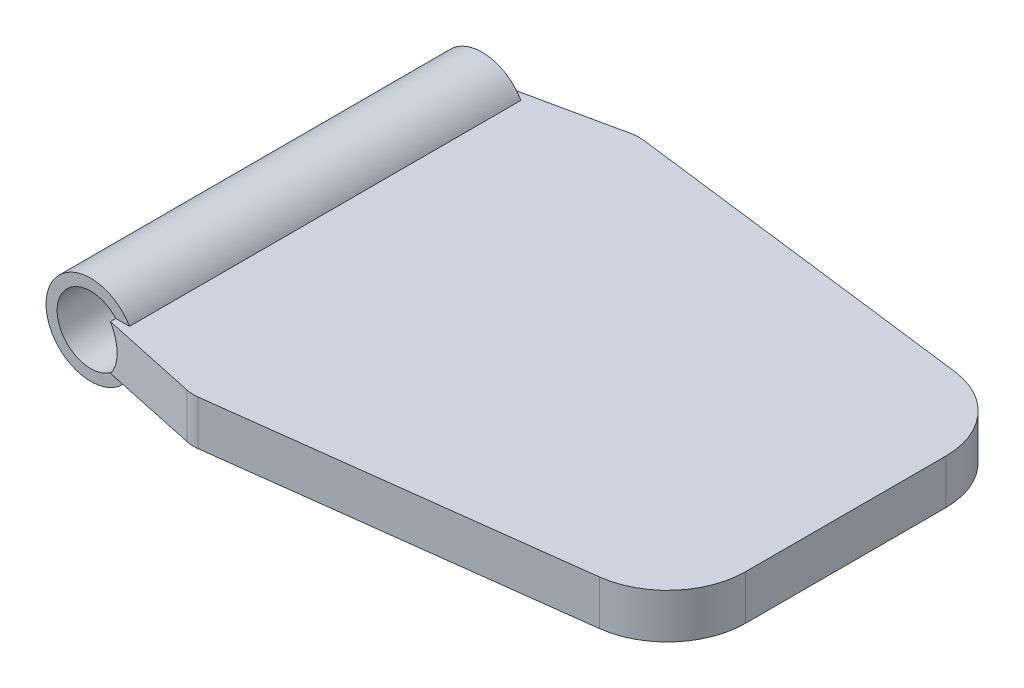
ISO-10303-21;
HEADER;
FILE_DESCRIPTION(('STEP AP214'),'2;1');
FILE_NAME('part.step','',(''),(''),'','','');
FILE_SCHEMA(('AUTOMOTIVE_DESIGN { 1 0 10303 214 1 1 1 1 }'));
ENDSEC;
DATA;
#1=APPLICATION_CONTEXT('core data for automotive mechanical design processes');
#2=APPLICATION_PROTOCOL_DEFINITION('international standard','automotive_design',2000,#1);
#3=PRODUCT_CONTEXT('',#1,'mechanical');
#4=PRODUCT('Part','Part','',(#3));
#5=PRODUCT_RELATED_PRODUCT_CATEGORY('part','',(#4));
#6=PRODUCT_DEFINITION_FORMATION('','',#4);
#7=PRODUCT_DEFINITION_CONTEXT('part definition',#1,'design');
#8=PRODUCT_DEFINITION('design','',#6,#7);
#9=PRODUCT_DEFINITION_SHAPE('','',#8);
#10=(LENGTH_UNIT() NAMED_UNIT(*) SI_UNIT(.MILLI.,.METRE.));
#11=(NAMED_UNIT(*) PLANE_ANGLE_UNIT() SI_UNIT($,.RADIAN.));
#12=(NAMED_UNIT(*) SI_UNIT($,.STERADIAN.) SOLID_ANGLE_UNIT());
#13=UNCERTAINTY_MEASURE_WITH_UNIT(LENGTH_MEASURE(1.E-05),#10,'distance_accuracy_value','');
#14=(GEOMETRIC_REPRESENTATION_CONTEXT(3) GLOBAL_UNCERTAINTY_ASSIGNED_CONTEXT((#13)) GLOBAL_UNIT_ASSIGNED_CONTEXT((#10,
#11,#12)) REPRESENTATION_CONTEXT('',''));
#15=CARTESIAN_POINT('',(0.,0.,0.));
#16=DIRECTION('',(0.,0.,1.));
#17=DIRECTION('',(1.,0.,0.));
#18=AXIS2_PLACEMENT_3D('',#15,#16,#17);
#19=CARTESIAN_POINT('',(0.,10.16,88.9));
#20=DIRECTION('',(0.210109323710123,0.,-0.977677897924503));
#21=DIRECTION('',(-0.977677897924503,0.,-0.210109323710123));
#22=AXIS2_PLACEMENT_3D('',#19,#20,#21);
#23=PLANE('',#22);
#24=DIRECTION('',(0.977677897924503,0.,0.210109323710123));
#25=VECTOR('',#24,1.);
#26=CARTESIAN_POINT('',(0.,10.16,88.9));
#27=LINE('',#26,#25);
#28=CARTESIAN_POINT('',(5.67961266284946,10.16,90.1205856121531));
#29=VERTEX_POINT('',#28);
#30=CARTESIAN_POINT('',(27.899788868323,10.16,94.8958456493932));
#31=VERTEX_POINT('',#30);
#32=EDGE_CURVE('E162',#29,#31,#27,.T.);
#33=ORIENTED_EDGE('',*,*,#32,.F.);
#34=CARTESIAN_POINT('',(0.,5.08,88.9));
#35=DIRECTION('',(0.210109323710123,0.,-0.977677897924503));
#36=DIRECTION('',(0.977677897924503,0.,0.210109323710123));
#37=AXIS2_PLACEMENT_3D('',#34,#35,#36);
#38=ELLIPSE('',#37,7.79397797186208,7.62);
#39=CARTESIAN_POINT('',(5.67961266284946,0.,90.1205856121531));
#40=VERTEX_POINT('',#39);
#41=EDGE_CURVE('E239',#29,#40,#38,.T.);
#42=ORIENTED_EDGE('',*,*,#41,.T.);
#43=DIRECTION('',(0.977677897924503,0.,0.210109323710123));
#44=VECTOR('',#43,1.);
#45=CARTESIAN_POINT('',(0.,0.,88.9));
#46=LINE('',#45,#44);
#47=CARTESIAN_POINT('',(27.899788868323,0.,94.8958456493932));
#48=VERTEX_POINT('',#47);
#49=EDGE_CURVE('E161',#40,#48,#46,.T.);
#50=ORIENTED_EDGE('',*,*,#49,.T.);
#51=DIRECTION('',(0.,-1.,0.));
#52=VECTOR('',#51,1.);
#53=CARTESIAN_POINT('',(27.899788868323,10.16,94.8958456493932));
#54=LINE('',#53,#52);
#55=EDGE_CURVE('E218',#31,#48,#54,.T.);
#56=ORIENTED_EDGE('',*,*,#55,.F.);
#57=EDGE_LOOP('',(#33,#42,#50,#56));
#58=FACE_BOUND('',#57,.T.);
#59=ADVANCED_FACE('F33',(#58),#23,.F.);
#60=CARTESIAN_POINT('',(29.5008219149942,10.16,87.4459400672085));
#61=DIRECTION('',(0.,-1.,0.));
#62=DIRECTION('',(0.,0.,-1.));
#63=AXIS2_PLACEMENT_3D('',#60,#61,#62);
#64=CYLINDRICAL_SURFACE('',#63,7.61999999999999);
#65=CARTESIAN_POINT('',(29.5008219149942,0.,87.4459400672085));
#66=DIRECTION('',(0.,1.,0.));
#67=DIRECTION('',(0.,0.,-1.));
#68=AXIS2_PLACEMENT_3D('',#65,#66,#67);
#69=CIRCLE('',#68,7.61999999999999);
#70=CARTESIAN_POINT('',(30.4518805531933,0.,95.0063558935178));
#71=VERTEX_POINT('',#70);
#72=EDGE_CURVE('E182',#48,#71,#69,.T.);
#73=ORIENTED_EDGE('',*,*,#72,.T.);
#74=DIRECTION('',(0.,-1.,0.));
#75=VECTOR('',#74,1.);
#76=CARTESIAN_POINT('',(30.4518805531933,10.16,95.0063558935178));
#77=LINE('',#76,#75);
#78=CARTESIAN_POINT('',(30.4518805531933,10.16,95.0063558935178));
#79=VERTEX_POINT('',#78);
#80=EDGE_CURVE('E215',#79,#71,#77,.T.);
#81=ORIENTED_EDGE('',*,*,#80,.F.);
#82=CARTESIAN_POINT('',(29.5008219149942,10.16,87.4459400672085));
#83=DIRECTION('',(0.,1.,0.));
#84=DIRECTION('',(0.,0.,-1.));
#85=AXIS2_PLACEMENT_3D('',#82,#83,#84);
#86=CIRCLE('',#85,7.61999999999999);
#87=EDGE_CURVE('E164',#31,#79,#86,.T.);
#88=ORIENTED_EDGE('',*,*,#87,.F.);
#89=ORIENTED_EDGE('',*,*,#55,.T.);
#90=EDGE_LOOP('',(#73,#81,#88,#89));
#91=FACE_BOUND('',#90,.T.);
#92=ADVANCED_FACE('F251',(#91),#64,.T.);
#93=CARTESIAN_POINT('',(30.4518805531933,10.16,95.0063558935178));
#94=DIRECTION('',(-0.124810844908009,0.,-0.992180554633757));
#95=DIRECTION('',(-0.992180554633757,0.,0.124810844908009));
#96=AXIS2_PLACEMENT_3D('',#93,#94,#95);
#97=PLANE('',#96);
#98=DIRECTION('',(0.992180554633757,0.,-0.124810844908009));
#99=VECTOR('',#98,1.);
#100=CARTESIAN_POINT('',(30.4518805531933,0.,95.0063558935178));
#101=LINE('',#100,#99);
#102=CARTESIAN_POINT('',(111.439136822464,0.,84.8186054538003));
#103=VERTEX_POINT('',#102);
#104=EDGE_CURVE('E184',#71,#103,#101,.T.);
#105=ORIENTED_EDGE('',*,*,#104,.T.);
#106=DIRECTION('',(0.,-1.,0.));
#107=VECTOR('',#106,1.);
#108=CARTESIAN_POINT('',(111.439136822464,10.16,84.8186054538003));
#109=LINE('',#108,#107);
#110=CARTESIAN_POINT('',(111.439136822464,10.16,84.8186054538003));
#111=VERTEX_POINT('',#110);
#112=EDGE_CURVE('E212',#111,#103,#109,.T.);
#113=ORIENTED_EDGE('',*,*,#112,.F.);
#114=DIRECTION('',(0.992180554633757,0.,-0.124810844908009));
#115=VECTOR('',#114,1.);
#116=CARTESIAN_POINT('',(30.4518805531933,10.16,95.0063558935178));
#117=LINE('',#116,#115);
#118=EDGE_CURVE('E167',#79,#111,#117,.T.);
#119=ORIENTED_EDGE('',*,*,#118,.F.);
#120=ORIENTED_EDGE('',*,*,#80,.T.);
#121=EDGE_LOOP('',(#105,#113,#119,#120));
#122=FACE_BOUND('',#121,.T.);
#123=ADVANCED_FACE('F257',(#122),#97,.F.);
#124=CARTESIAN_POINT('',(109.22,10.16,67.1776351924121));
#125=DIRECTION('',(0.,-1.,0.));
#126=DIRECTION('',(0.,0.,-1.));
#127=AXIS2_PLACEMENT_3D('',#124,#125,#126);
#128=CYLINDRICAL_SURFACE('',#127,17.78);
#129=CARTESIAN_POINT('',(109.22,0.,67.1776351924121));
#130=DIRECTION('',(0.,1.,0.));
#131=DIRECTION('',(0.,0.,1.));
#132=AXIS2_PLACEMENT_3D('',#129,#130,#131);
#133=CIRCLE('',#132,17.78);
#134=CARTESIAN_POINT('',(127.,0.,67.177635192412));
#135=VERTEX_POINT('',#134);
#136=EDGE_CURVE('E186',#103,#135,#133,.T.);
#137=ORIENTED_EDGE('',*,*,#136,.T.);
#138=DIRECTION('',(0.,-1.,0.));
#139=VECTOR('',#138,1.);
#140=CARTESIAN_POINT('',(127.,10.16,67.177635192412));
#141=LINE('',#140,#139);
#142=CARTESIAN_POINT('',(127.,10.16,67.177635192412));
#143=VERTEX_POINT('',#142);
#144=EDGE_CURVE('E209',#143,#135,#141,.T.);
#145=ORIENTED_EDGE('',*,*,#144,.F.);
#146=CARTESIAN_POINT('',(109.22,10.16,67.1776351924121));
#147=DIRECTION('',(0.,1.,0.));
#148=DIRECTION('',(0.,0.,1.));
#149=AXIS2_PLACEMENT_3D('',#146,#147,#148);
#150=CIRCLE('',#149,17.78);
#151=EDGE_CURVE('E169',#111,#143,#150,.T.);
#152=ORIENTED_EDGE('',*,*,#151,.F.);
#153=ORIENTED_EDGE('',*,*,#112,.T.);
#154=EDGE_LOOP('',(#137,#145,#152,#153));
#155=FACE_BOUND('',#154,.T.);
#156=ADVANCED_FACE('F261',(#155),#128,.T.);
#157=CARTESIAN_POINT('',(127.,10.16,21.722364807588));
#158=DIRECTION('',(-1.,0.,0.));
#159=DIRECTION('',(0.,0.,1.));
#160=AXIS2_PLACEMENT_3D('',#157,#158,#159);
#161=PLANE('',#160);
#162=DIRECTION('',(0.,0.,-1.));
#163=VECTOR('',#162,1.);
#164=CARTESIAN_POINT('',(127.,0.,21.722364807588));
#165=LINE('',#164,#163);
#166=CARTESIAN_POINT('',(127.,0.,21.722364807588));
#167=VERTEX_POINT('',#166);
#168=EDGE_CURVE('E188',#135,#167,#165,.T.);
#169=ORIENTED_EDGE('',*,*,#168,.T.);
#170=DIRECTION('',(0.,-1.,0.));
#171=VECTOR('',#170,1.);
#172=CARTESIAN_POINT('',(127.,10.16,21.722364807588));
#173=LINE('',#172,#171);
#174=CARTESIAN_POINT('',(127.,10.16,21.722364807588));
#175=VERTEX_POINT('',#174);
#176=EDGE_CURVE('E206',#175,#167,#173,.T.);
#177=ORIENTED_EDGE('',*,*,#176,.F.);
#178=DIRECTION('',(0.,0.,-1.));
#179=VECTOR('',#178,1.);
#180=CARTESIAN_POINT('',(127.,10.16,21.722364807588));
#181=LINE('',#180,#179);
#182=EDGE_CURVE('E171',#143,#175,#181,.T.);
#183=ORIENTED_EDGE('',*,*,#182,.F.);
#184=ORIENTED_EDGE('',*,*,#144,.T.);
#185=EDGE_LOOP('',(#169,#177,#183,#184));
#186=FACE_BOUND('',#185,.T.);
#187=ADVANCED_FACE('F266',(#186),#161,.F.);
#188=CARTESIAN_POINT('',(109.22,10.16,21.7223648075879));
#189=DIRECTION('',(0.,-1.,0.));
#190=DIRECTION('',(0.,0.,-1.));
#191=AXIS2_PLACEMENT_3D('',#188,#189,#190);
#192=CYLINDRICAL_SURFACE('',#191,17.78);
#193=CARTESIAN_POINT('',(109.22,0.,21.7223648075879));
#194=DIRECTION('',(0.,1.,0.));
#195=DIRECTION('',(0.,0.,1.));
#196=AXIS2_PLACEMENT_3D('',#193,#194,#195);
#197=CIRCLE('',#196,17.78);
#198=CARTESIAN_POINT('',(111.439136822464,0.,4.0813945461997));
#199=VERTEX_POINT('',#198);
#200=EDGE_CURVE('E190',#167,#199,#197,.T.);
#201=ORIENTED_EDGE('',*,*,#200,.T.);
#202=DIRECTION('',(0.,-1.,0.));
#203=VECTOR('',#202,1.);
#204=CARTESIAN_POINT('',(111.439136822464,10.16,4.0813945461997));
#205=LINE('',#204,#203);
#206=CARTESIAN_POINT('',(111.439136822464,10.16,4.0813945461997));
#207=VERTEX_POINT('',#206);
#208=EDGE_CURVE('E203',#207,#199,#205,.T.);
#209=ORIENTED_EDGE('',*,*,#208,.F.);
#210=CARTESIAN_POINT('',(109.22,10.16,21.7223648075879));
#211=DIRECTION('',(0.,1.,0.));
#212=DIRECTION('',(0.,0.,1.));
#213=AXIS2_PLACEMENT_3D('',#210,#211,#212);
#214=CIRCLE('',#213,17.78);
#215=EDGE_CURVE('E173',#175,#207,#214,.T.);
#216=ORIENTED_EDGE('',*,*,#215,.F.);
#217=ORIENTED_EDGE('',*,*,#176,.T.);
#218=EDGE_LOOP('',(#201,#209,#216,#217));
#219=FACE_BOUND('',#218,.T.);
#220=ADVANCED_FACE('F272',(#219),#192,.T.);
#221=CARTESIAN_POINT('',(30.4518805531933,10.16,-6.10635589351778));
#222=DIRECTION('',(-0.124810844908009,0.,0.992180554633757));
#223=DIRECTION('',(0.992180554633757,0.,0.124810844908009));
#224=AXIS2_PLACEMENT_3D('',#221,#222,#223);
#225=PLANE('',#224);
#226=DIRECTION('',(-0.992180554633757,0.,-0.124810844908009));
#227=VECTOR('',#226,1.);
#228=CARTESIAN_POINT('',(30.4518805531933,0.,-6.10635589351778));
#229=LINE('',#228,#227);
#230=CARTESIAN_POINT('',(30.4518805531933,0.,-6.10635589351778));
#231=VERTEX_POINT('',#230);
#232=EDGE_CURVE('E192',#199,#231,#229,.T.);
#233=ORIENTED_EDGE('',*,*,#232,.T.);
#234=DIRECTION('',(0.,-1.,0.));
#235=VECTOR('',#234,1.);
#236=CARTESIAN_POINT('',(30.4518805531933,10.16,-6.10635589351778));
#237=LINE('',#236,#235);
#238=CARTESIAN_POINT('',(30.4518805531933,10.16,-6.10635589351778));
#239=VERTEX_POINT('',#238);
#240=EDGE_CURVE('E200',#239,#231,#237,.T.);
#241=ORIENTED_EDGE('',*,*,#240,.F.);
#242=DIRECTION('',(-0.992180554633757,0.,-0.124810844908009));
#243=VECTOR('',#242,1.);
#244=CARTESIAN_POINT('',(30.4518805531933,10.16,-6.10635589351778));
#245=LINE('',#244,#243);
#246=EDGE_CURVE('E175',#207,#239,#245,.T.);
#247=ORIENTED_EDGE('',*,*,#246,.F.);
#248=ORIENTED_EDGE('',*,*,#208,.T.);
#249=EDGE_LOOP('',(#233,#241,#247,#248));
#250=FACE_BOUND('',#249,.T.);
#251=ADVANCED_FACE('F276',(#250),#225,.F.);
#252=CARTESIAN_POINT('',(29.5008219149942,10.16,1.45405993279144));
#253=DIRECTION('',(0.,-1.,0.));
#254=DIRECTION('',(0.,0.,-1.));
#255=AXIS2_PLACEMENT_3D('',#252,#253,#254);
#256=CYLINDRICAL_SURFACE('',#255,7.62);
#257=CARTESIAN_POINT('',(29.5008219149942,0.,1.45405993279144));
#258=DIRECTION('',(0.,1.,0.));
#259=DIRECTION('',(0.,0.,1.));
#260=AXIS2_PLACEMENT_3D('',#257,#258,#259);
#261=CIRCLE('',#260,7.62);
#262=CARTESIAN_POINT('',(27.899788868323,0.,-5.99584564939326));
#263=VERTEX_POINT('',#262);
#264=EDGE_CURVE('E194',#231,#263,#261,.T.);
#265=ORIENTED_EDGE('',*,*,#264,.T.);
#266=DIRECTION('',(0.,-1.,0.));
#267=VECTOR('',#266,1.);
#268=CARTESIAN_POINT('',(27.899788868323,10.16,-5.99584564939326));
#269=LINE('',#268,#267);
#270=CARTESIAN_POINT('',(27.899788868323,10.16,-5.99584564939326));
#271=VERTEX_POINT('',#270);
#272=EDGE_CURVE('E180',#271,#263,#269,.T.);
#273=ORIENTED_EDGE('',*,*,#272,.F.);
#274=CARTESIAN_POINT('',(29.5008219149942,10.16,1.45405993279144));
#275=DIRECTION('',(0.,1.,0.));
#276=DIRECTION('',(0.,0.,1.));
#277=AXIS2_PLACEMENT_3D('',#274,#275,#276);
#278=CIRCLE('',#277,7.62);
#279=EDGE_CURVE('E177',#239,#271,#278,.T.);
#280=ORIENTED_EDGE('',*,*,#279,.F.);
#281=ORIENTED_EDGE('',*,*,#240,.T.);
#282=EDGE_LOOP('',(#265,#273,#280,#281));
#283=FACE_BOUND('',#282,.T.);
#284=ADVANCED_FACE('F281',(#283),#256,.T.);
#285=CARTESIAN_POINT('',(0.,10.16,0.));
#286=DIRECTION('',(0.210109323710123,0.,0.977677897924503));
#287=DIRECTION('',(0.977677897924503,0.,-0.210109323710123));
#288=AXIS2_PLACEMENT_3D('',#285,#286,#287);
#289=PLANE('',#288);
#290=DIRECTION('',(-0.977677897924503,0.,0.210109323710123));
#291=VECTOR('',#290,1.);
#292=CARTESIAN_POINT('',(0.,0.,0.));
#293=LINE('',#292,#291);
#294=CARTESIAN_POINT('',(5.67961266284946,0.,-1.22058561215312));
#295=VERTEX_POINT('',#294);
#296=EDGE_CURVE('E165',#263,#295,#293,.T.);
#297=ORIENTED_EDGE('',*,*,#296,.T.);
#298=CARTESIAN_POINT('',(0.,5.08,0.));
#299=DIRECTION('',(0.210109323710123,0.,0.977677897924503));
#300=DIRECTION('',(-0.977677897924503,0.,0.210109323710123));
#301=AXIS2_PLACEMENT_3D('',#298,#299,#300);
#302=ELLIPSE('',#301,7.79397797186208,7.62);
#303=CARTESIAN_POINT('',(5.67961266284946,10.16,-1.22058561215312));
#304=VERTEX_POINT('',#303);
#305=EDGE_CURVE('E144',#295,#304,#302,.T.);
#306=ORIENTED_EDGE('',*,*,#305,.T.);
#307=DIRECTION('',(-0.977677897924503,0.,0.210109323710123));
#308=VECTOR('',#307,1.);
#309=CARTESIAN_POINT('',(0.,10.16,0.));
#310=LINE('',#309,#308);
#311=EDGE_CURVE('E143',#271,#304,#310,.T.);
#312=ORIENTED_EDGE('',*,*,#311,.F.);
#313=ORIENTED_EDGE('',*,*,#272,.T.);
#314=EDGE_LOOP('',(#297,#306,#312,#313));
#315=FACE_BOUND('',#314,.T.);
#316=ADVANCED_FACE('F284',(#315),#289,.F.);
#317=CARTESIAN_POINT('',(29.5008219149942,10.16,87.4459400672085));
#318=DIRECTION('',(0.,-1.,0.));
#319=DIRECTION('',(0.,0.,-1.));
#320=AXIS2_PLACEMENT_3D('',#317,#318,#319);
#321=PLANE('',#320);
#322=ORIENTED_EDGE('',*,*,#311,.T.);
#323=DIRECTION('',(0.,0.,1.));
#324=VECTOR('',#323,1.);
#325=CARTESIAN_POINT('',(5.67961266284946,10.16,-6.16594006720856));
#326=LINE('',#325,#324);
#327=CARTESIAN_POINT('',(5.67961266284946,10.16,0.));
#328=VERTEX_POINT('',#327);
#329=EDGE_CURVE('E131',#304,#328,#326,.T.);
#330=ORIENTED_EDGE('',*,*,#329,.T.);
#331=DIRECTION('',(-1.,0.,0.));
#332=VECTOR('',#331,1.);
#333=CARTESIAN_POINT('',(29.5008219149942,10.16,0.));
#334=LINE('',#333,#332);
#335=CARTESIAN_POINT('',(8.7988181024499,10.16,0.));
#336=VERTEX_POINT('',#335);
#337=EDGE_CURVE('E141',#336,#328,#334,.T.);
#338=ORIENTED_EDGE('',*,*,#337,.F.);
#339=DIRECTION('',(0.,0.,-1.));
#340=VECTOR('',#339,1.);
#341=CARTESIAN_POINT('',(8.7988181024499,10.16,88.9));
#342=LINE('',#341,#340);
#343=CARTESIAN_POINT('',(8.7988181024499,10.16,88.9));
#344=VERTEX_POINT('',#343);
#345=EDGE_CURVE('E154',#344,#336,#342,.T.);
#346=ORIENTED_EDGE('',*,*,#345,.F.);
#347=DIRECTION('',(-1.,0.,0.));
#348=VECTOR('',#347,1.);
#349=CARTESIAN_POINT('',(29.5008219149942,10.16,88.9));
#350=LINE('',#349,#348);
#351=CARTESIAN_POINT('',(5.67961266284946,10.16,88.9));
#352=VERTEX_POINT('',#351);
#353=EDGE_CURVE('E150',#344,#352,#350,.T.);
#354=ORIENTED_EDGE('',*,*,#353,.T.);
#355=EDGE_CURVE('E47',#352,#29,#326,.T.);
#356=ORIENTED_EDGE('',*,*,#355,.T.);
#357=ORIENTED_EDGE('',*,*,#32,.T.);
#358=ORIENTED_EDGE('',*,*,#87,.T.);
#359=ORIENTED_EDGE('',*,*,#118,.T.);
#360=ORIENTED_EDGE('',*,*,#151,.T.);
#361=ORIENTED_EDGE('',*,*,#182,.T.);
#362=ORIENTED_EDGE('',*,*,#215,.T.);
#363=ORIENTED_EDGE('',*,*,#246,.T.);
#364=ORIENTED_EDGE('',*,*,#279,.T.);
#365=EDGE_LOOP('',(#322,#330,#338,#346,#354,#356,#357,#358,#359,#360,#361,#362,#363,#364));
#366=FACE_BOUND('',#365,.T.);
#367=ADVANCED_FACE('F139',(#366),#321,.F.);
#368=CARTESIAN_POINT('',(29.5008219149942,0.,87.4459400672085));
#369=DIRECTION('',(0.,-1.,0.));
#370=DIRECTION('',(0.,0.,-1.));
#371=AXIS2_PLACEMENT_3D('',#368,#369,#370);
#372=PLANE('',#371);
#373=DIRECTION('',(0.,0.,1.));
#374=VECTOR('',#373,1.);
#375=CARTESIAN_POINT('',(5.67961266284946,0.,-6.16594006720856));
#376=LINE('',#375,#374);
#377=CARTESIAN_POINT('',(5.67961266284946,0.,0.));
#378=VERTEX_POINT('',#377);
#379=EDGE_CURVE('E55',#295,#378,#376,.T.);
#380=ORIENTED_EDGE('',*,*,#379,.F.);
#381=ORIENTED_EDGE('',*,*,#296,.F.);
#382=ORIENTED_EDGE('',*,*,#264,.F.);
#383=ORIENTED_EDGE('',*,*,#232,.F.);
#384=ORIENTED_EDGE('',*,*,#200,.F.);
#385=ORIENTED_EDGE('',*,*,#168,.F.);
#386=ORIENTED_EDGE('',*,*,#136,.F.);
#387=ORIENTED_EDGE('',*,*,#104,.F.);
#388=ORIENTED_EDGE('',*,*,#72,.F.);
#389=ORIENTED_EDGE('',*,*,#49,.F.);
#390=CARTESIAN_POINT('',(5.67961266284946,0.,88.9));
#391=VERTEX_POINT('',#390);
#392=EDGE_CURVE('E235',#391,#40,#376,.T.);
#393=ORIENTED_EDGE('',*,*,#392,.F.);
#394=DIRECTION('',(-1.,0.,0.));
#395=VECTOR('',#394,1.);
#396=CARTESIAN_POINT('',(29.5008219149942,0.,88.9));
#397=LINE('',#396,#395);
#398=CARTESIAN_POINT('',(8.7988181024499,0.,88.9));
#399=VERTEX_POINT('',#398);
#400=EDGE_CURVE('E40',#399,#391,#397,.T.);
#401=ORIENTED_EDGE('',*,*,#400,.F.);
#402=DIRECTION('',(0.,0.,-1.));
#403=VECTOR('',#402,1.);
#404=CARTESIAN_POINT('',(8.7988181024499,0.,88.9));
#405=LINE('',#404,#403);
#406=CARTESIAN_POINT('',(8.7988181024499,0.,0.));
#407=VERTEX_POINT('',#406);
#408=EDGE_CURVE('E223',#399,#407,#405,.T.);
#409=ORIENTED_EDGE('',*,*,#408,.T.);
#410=DIRECTION('',(-1.,0.,0.));
#411=VECTOR('',#410,1.);
#412=CARTESIAN_POINT('',(29.5008219149942,0.,0.));
#413=LINE('',#412,#411);
#414=EDGE_CURVE('E221',#407,#378,#413,.T.);
#415=ORIENTED_EDGE('',*,*,#414,.T.);
#416=EDGE_LOOP('',(#380,#381,#382,#383,#384,#385,#386,#387,#388,#389,#393,#401,#409,#415));
#417=FACE_BOUND('',#416,.T.);
#418=ADVANCED_FACE('F233',(#417),#372,.T.);
#419=CARTESIAN_POINT('',(0.,5.08,88.9));
#420=DIRECTION('',(0.,0.,-1.));
#421=DIRECTION('',(-1.,0.,0.));
#422=AXIS2_PLACEMENT_3D('',#419,#420,#421);
#423=CYLINDRICAL_SURFACE('',#422,10.16);
#424=CARTESIAN_POINT('',(0.,5.08,88.9));
#425=DIRECTION('',(0.,0.,1.));
#426=DIRECTION('',(1.,0.,0.));
#427=AXIS2_PLACEMENT_3D('',#424,#425,#426);
#428=CIRCLE('',#427,10.16);
#429=EDGE_CURVE('E151',#344,#399,#428,.T.);
#430=ORIENTED_EDGE('',*,*,#429,.F.);
#431=ORIENTED_EDGE('',*,*,#345,.T.);
#432=CARTESIAN_POINT('',(0.,5.08,0.));
#433=DIRECTION('',(0.,0.,1.));
#434=DIRECTION('',(1.,0.,0.));
#435=AXIS2_PLACEMENT_3D('',#432,#433,#434);
#436=CIRCLE('',#435,10.16);
#437=EDGE_CURVE('E149',#336,#407,#436,.T.);
#438=ORIENTED_EDGE('',*,*,#437,.T.);
#439=ORIENTED_EDGE('',*,*,#408,.F.);
#440=EDGE_LOOP('',(#430,#431,#438,#439));
#441=FACE_BOUND('',#440,.T.);
#442=ADVANCED_FACE('F246',(#441),#423,.T.);
#443=CARTESIAN_POINT('',(0.,5.08,88.9));
#444=DIRECTION('',(0.,0.,1.));
#445=DIRECTION('',(1.,0.,0.));
#446=AXIS2_PLACEMENT_3D('',#443,#444,#445);
#447=PLANE('',#446);
#448=CARTESIAN_POINT('',(0.,5.08,88.9));
#449=DIRECTION('',(0.,0.,1.));
#450=DIRECTION('',(1.,0.,0.));
#451=AXIS2_PLACEMENT_3D('',#448,#449,#450);
#452=CIRCLE('',#451,7.62);
#453=EDGE_CURVE('E229',#352,#391,#452,.T.);
#454=ORIENTED_EDGE('',*,*,#453,.F.);
#455=ORIENTED_EDGE('',*,*,#353,.F.);
#456=ORIENTED_EDGE('',*,*,#429,.T.);
#457=ORIENTED_EDGE('',*,*,#400,.T.);
#458=EDGE_LOOP('',(#454,#455,#456,#457));
#459=FACE_BOUND('',#458,.T.);
#460=ADVANCED_FACE('F228',(#459),#447,.T.);
#461=CARTESIAN_POINT('',(0.,5.08,0.));
#462=DIRECTION('',(0.,0.,1.));
#463=DIRECTION('',(1.,0.,0.));
#464=AXIS2_PLACEMENT_3D('',#461,#462,#463);
#465=PLANE('',#464);
#466=ORIENTED_EDGE('',*,*,#337,.T.);
#467=CARTESIAN_POINT('',(0.,5.08,0.));
#468=DIRECTION('',(0.,0.,1.));
#469=DIRECTION('',(1.,0.,0.));
#470=AXIS2_PLACEMENT_3D('',#467,#468,#469);
#471=CIRCLE('',#470,7.62);
#472=EDGE_CURVE('E11',#328,#378,#471,.T.);
#473=ORIENTED_EDGE('',*,*,#472,.T.);
#474=ORIENTED_EDGE('',*,*,#414,.F.);
#475=ORIENTED_EDGE('',*,*,#437,.F.);
#476=EDGE_LOOP('',(#466,#473,#474,#475));
#477=FACE_BOUND('',#476,.T.);
#478=ADVANCED_FACE('F147',(#477),#465,.F.);
#479=CARTESIAN_POINT('',(0.,5.08,-6.16594006720856));
#480=DIRECTION('',(0.,0.,1.));
#481=DIRECTION('',(1.,0.,0.));
#482=AXIS2_PLACEMENT_3D('',#479,#480,#481);
#483=CYLINDRICAL_SURFACE('',#482,7.62);
#484=ORIENTED_EDGE('',*,*,#379,.T.);
#485=ORIENTED_EDGE('',*,*,#472,.F.);
#486=ORIENTED_EDGE('',*,*,#329,.F.);
#487=ORIENTED_EDGE('',*,*,#305,.F.);
#488=EDGE_LOOP('',(#484,#485,#486,#487));
#489=FACE_BOUND('',#488,.T.);
#490=ORIENTED_EDGE('',*,*,#355,.F.);
#491=ORIENTED_EDGE('',*,*,#453,.T.);
#492=ORIENTED_EDGE('',*,*,#392,.T.);
#493=ORIENTED_EDGE('',*,*,#41,.F.);
#494=EDGE_LOOP('',(#490,#491,#492,#493));
#495=FACE_BOUND('',#494,.T.);
#496=ADVANCED_FACE('F130',(#489,#495),#483,.F.);
#497=CLOSED_SHELL('',(#59,#92,#123,#156,#187,#220,#251,#284,#316,#367,#418,#442,#460,#478,#496));
#498=MANIFOLD_SOLID_BREP('B2',#497);
#499=ADVANCED_BREP_SHAPE_REPRESENTATION('',(#18,#498),#14);
#500=SHAPE_DEFINITION_REPRESENTATION(#9,#499);
ENDSEC;
END-ISO-10303-21;
